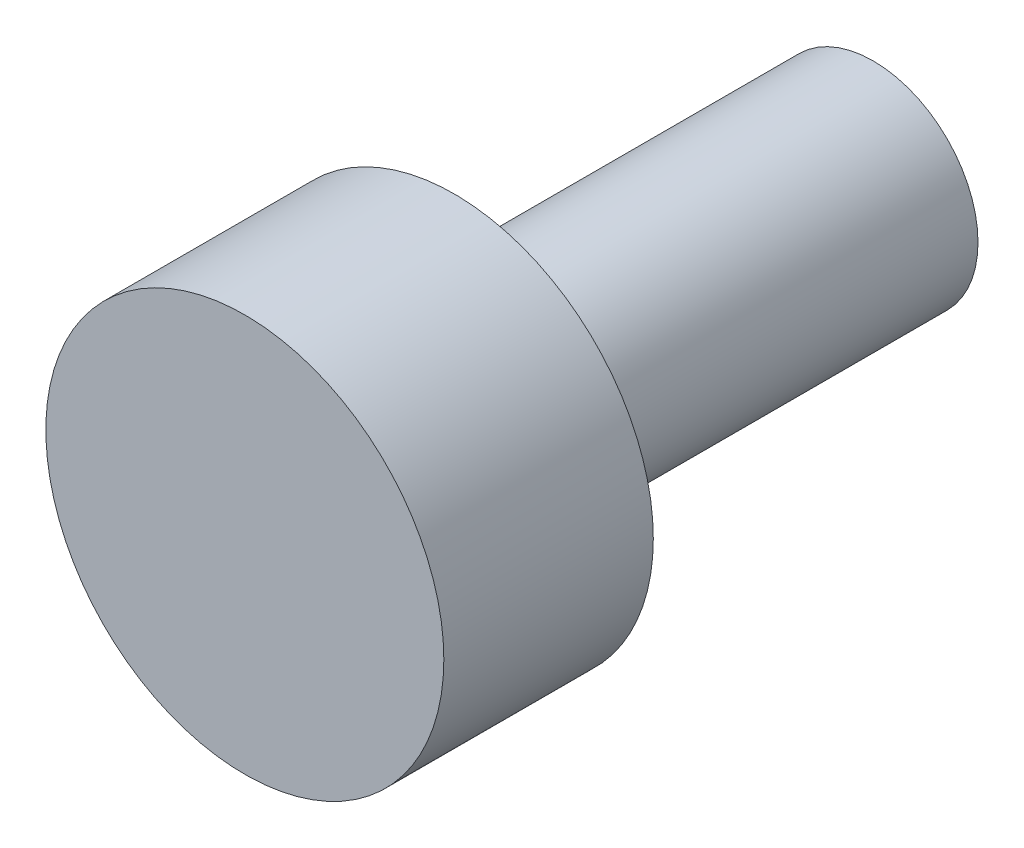
ISO-10303-21;
HEADER;
FILE_DESCRIPTION(('STEP AP214'),'2;1');
FILE_NAME('part.step','',(''),(''),'','','');
FILE_SCHEMA(('AUTOMOTIVE_DESIGN { 1 0 10303 214 1 1 1 1 }'));
ENDSEC;
DATA;
#1=APPLICATION_CONTEXT('core data for automotive mechanical design processes');
#2=APPLICATION_PROTOCOL_DEFINITION('international standard','automotive_design',2000,#1);
#3=PRODUCT_CONTEXT('',#1,'mechanical');
#4=PRODUCT('Part','Part','',(#3));
#5=PRODUCT_RELATED_PRODUCT_CATEGORY('part','',(#4));
#6=PRODUCT_DEFINITION_FORMATION('','',#4);
#7=PRODUCT_DEFINITION_CONTEXT('part definition',#1,'design');
#8=PRODUCT_DEFINITION('design','',#6,#7);
#9=PRODUCT_DEFINITION_SHAPE('','',#8);
#10=(LENGTH_UNIT() NAMED_UNIT(*) SI_UNIT(.MILLI.,.METRE.));
#11=(NAMED_UNIT(*) PLANE_ANGLE_UNIT() SI_UNIT($,.RADIAN.));
#12=(NAMED_UNIT(*) SI_UNIT($,.STERADIAN.) SOLID_ANGLE_UNIT());
#13=UNCERTAINTY_MEASURE_WITH_UNIT(LENGTH_MEASURE(1.E-05),#10,'distance_accuracy_value','');
#14=(GEOMETRIC_REPRESENTATION_CONTEXT(3) GLOBAL_UNCERTAINTY_ASSIGNED_CONTEXT((#13)) GLOBAL_UNIT_ASSIGNED_CONTEXT((#10,
#11,#12)) REPRESENTATION_CONTEXT('',''));
#15=CARTESIAN_POINT('',(0.,0.,0.));
#16=DIRECTION('',(0.,0.,1.));
#17=DIRECTION('',(1.,0.,0.));
#18=AXIS2_PLACEMENT_3D('',#15,#16,#17);
#19=CARTESIAN_POINT('',(0.,0.,6.));
#20=DIRECTION('',(0.,0.,-1.));
#21=DIRECTION('',(-1.,0.,0.));
#22=AXIS2_PLACEMENT_3D('',#19,#20,#21);
#23=CYLINDRICAL_SURFACE('',#22,1.5);
#24=CARTESIAN_POINT('',(0.,0.,6.));
#25=DIRECTION('',(0.,0.,1.));
#26=DIRECTION('',(1.,0.,0.));
#27=AXIS2_PLACEMENT_3D('',#24,#25,#26);
#28=CIRCLE('',#27,1.5);
#29=CARTESIAN_POINT('',(1.5,0.,6.));
#30=VERTEX_POINT('',#29);
#31=EDGE_CURVE('E10',#30,#30,#28,.T.);
#32=ORIENTED_EDGE('',*,*,#31,.F.);
#33=EDGE_LOOP('',(#32));
#34=FACE_BOUND('',#33,.T.);
#35=CARTESIAN_POINT('',(0.,0.,0.));
#36=DIRECTION('',(0.,0.,1.));
#37=DIRECTION('',(1.,0.,0.));
#38=AXIS2_PLACEMENT_3D('',#35,#36,#37);
#39=CIRCLE('',#38,1.5);
#40=CARTESIAN_POINT('',(1.5,0.,0.));
#41=VERTEX_POINT('',#40);
#42=EDGE_CURVE('E36',#41,#41,#39,.T.);
#43=ORIENTED_EDGE('',*,*,#42,.T.);
#44=EDGE_LOOP('',(#43));
#45=FACE_BOUND('',#44,.T.);
#46=ADVANCED_FACE('F33',(#34,#45),#23,.T.);
#47=CARTESIAN_POINT('',(0.,0.,0.));
#48=DIRECTION('',(0.,0.,1.));
#49=DIRECTION('',(1.,0.,0.));
#50=AXIS2_PLACEMENT_3D('',#47,#48,#49);
#51=PLANE('',#50);
#52=ORIENTED_EDGE('',*,*,#42,.F.);
#53=EDGE_LOOP('',(#52));
#54=FACE_BOUND('',#53,.T.);
#55=ADVANCED_FACE('F56',(#54),#51,.F.);
#56=CARTESIAN_POINT('',(0.,0.,9.));
#57=DIRECTION('',(0.,0.,-1.));
#58=DIRECTION('',(-1.,0.,0.));
#59=AXIS2_PLACEMENT_3D('',#56,#57,#58);
#60=CYLINDRICAL_SURFACE('',#59,2.85);
#61=CARTESIAN_POINT('',(0.,0.,9.));
#62=DIRECTION('',(0.,0.,1.));
#63=DIRECTION('',(1.,0.,0.));
#64=AXIS2_PLACEMENT_3D('',#61,#62,#63);
#65=CIRCLE('',#64,2.85);
#66=CARTESIAN_POINT('',(2.85,0.,9.));
#67=VERTEX_POINT('',#66);
#68=EDGE_CURVE('E43',#67,#67,#65,.T.);
#69=ORIENTED_EDGE('',*,*,#68,.F.);
#70=EDGE_LOOP('',(#69));
#71=FACE_BOUND('',#70,.T.);
#72=CARTESIAN_POINT('',(0.,0.,6.));
#73=DIRECTION('',(0.,0.,1.));
#74=DIRECTION('',(1.,0.,0.));
#75=AXIS2_PLACEMENT_3D('',#72,#73,#74);
#76=CIRCLE('',#75,2.85);
#77=CARTESIAN_POINT('',(2.85,0.,6.));
#78=VERTEX_POINT('',#77);
#79=EDGE_CURVE('E45',#78,#78,#76,.T.);
#80=ORIENTED_EDGE('',*,*,#79,.T.);
#81=EDGE_LOOP('',(#80));
#82=FACE_BOUND('',#81,.T.);
#83=ADVANCED_FACE('F53',(#71,#82),#60,.T.);
#84=CARTESIAN_POINT('',(0.,0.,9.));
#85=DIRECTION('',(0.,0.,1.));
#86=DIRECTION('',(1.,0.,0.));
#87=AXIS2_PLACEMENT_3D('',#84,#85,#86);
#88=PLANE('',#87);
#89=ORIENTED_EDGE('',*,*,#68,.T.);
#90=EDGE_LOOP('',(#89));
#91=FACE_BOUND('',#90,.T.);
#92=ADVANCED_FACE('F51',(#91),#88,.T.);
#93=CARTESIAN_POINT('',(0.,0.,6.));
#94=DIRECTION('',(0.,0.,1.));
#95=DIRECTION('',(1.,0.,0.));
#96=AXIS2_PLACEMENT_3D('',#93,#94,#95);
#97=PLANE('',#96);
#98=ORIENTED_EDGE('',*,*,#31,.T.);
#99=EDGE_LOOP('',(#98));
#100=FACE_BOUND('',#99,.T.);
#101=ORIENTED_EDGE('',*,*,#79,.F.);
#102=EDGE_LOOP('',(#101));
#103=FACE_BOUND('',#102,.T.);
#104=ADVANCED_FACE('F60',(#100,#103),#97,.F.);
#105=CLOSED_SHELL('',(#46,#55,#83,#92,#104));
#106=MANIFOLD_SOLID_BREP('B2',#105);
#107=ADVANCED_BREP_SHAPE_REPRESENTATION('',(#18,#106),#14);
#108=SHAPE_DEFINITION_REPRESENTATION(#9,#107);
ENDSEC;
END-ISO-10303-21;
